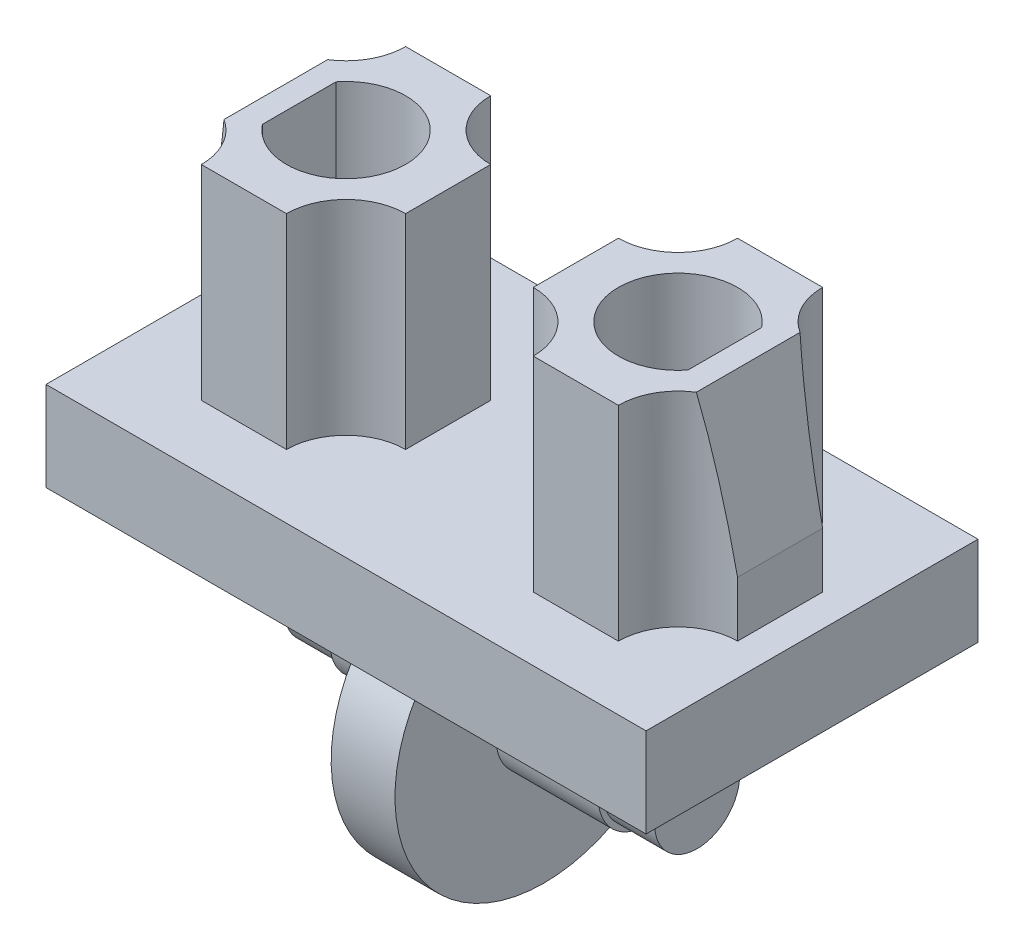
ISO-10303-21;
HEADER;
FILE_DESCRIPTION(('STEP AP214'),'2;1');
FILE_NAME('part.step','',(''),(''),'','','');
FILE_SCHEMA(('AUTOMOTIVE_DESIGN { 1 0 10303 214 1 1 1 1 }'));
ENDSEC;
DATA;
#1=APPLICATION_CONTEXT('core data for automotive mechanical design processes');
#2=APPLICATION_PROTOCOL_DEFINITION('international standard','automotive_design',2000,#1);
#3=PRODUCT_CONTEXT('',#1,'mechanical');
#4=PRODUCT('Part','Part','',(#3));
#5=PRODUCT_RELATED_PRODUCT_CATEGORY('part','',(#4));
#6=PRODUCT_DEFINITION_FORMATION('','',#4);
#7=PRODUCT_DEFINITION_CONTEXT('part definition',#1,'design');
#8=PRODUCT_DEFINITION('design','',#6,#7);
#9=PRODUCT_DEFINITION_SHAPE('','',#8);
#10=(LENGTH_UNIT() NAMED_UNIT(*) SI_UNIT(.MILLI.,.METRE.));
#11=(NAMED_UNIT(*) PLANE_ANGLE_UNIT() SI_UNIT($,.RADIAN.));
#12=(NAMED_UNIT(*) SI_UNIT($,.STERADIAN.) SOLID_ANGLE_UNIT());
#13=UNCERTAINTY_MEASURE_WITH_UNIT(LENGTH_MEASURE(1.E-05),#10,'distance_accuracy_value','');
#14=(GEOMETRIC_REPRESENTATION_CONTEXT(3) GLOBAL_UNCERTAINTY_ASSIGNED_CONTEXT((#13)) GLOBAL_UNIT_ASSIGNED_CONTEXT((#10,
#11,#12)) REPRESENTATION_CONTEXT('',''));
#15=CARTESIAN_POINT('',(0.,0.,0.));
#16=DIRECTION('',(0.,0.,1.));
#17=DIRECTION('',(1.,0.,0.));
#18=AXIS2_PLACEMENT_3D('',#15,#16,#17);
#19=CARTESIAN_POINT('',(-6.3,3.4,-0.999999999999999));
#20=DIRECTION('',(0.977802414077409,-0.209529088730873,0.));
#21=DIRECTION('',(0.,0.,-1.));
#22=AXIS2_PLACEMENT_3D('',#19,#20,#21);
#23=PLANE('',#22);
#24=DIRECTION('',(0.,0.,-1.));
#25=VECTOR('',#24,1.);
#26=CARTESIAN_POINT('',(-6.3,3.4,-0.999999999999999));
#27=LINE('',#26,#25);
#28=CARTESIAN_POINT('',(-6.3,3.4,1.));
#29=VERTEX_POINT('',#28);
#30=CARTESIAN_POINT('',(-6.3,3.4,-0.999999999999999));
#31=VERTEX_POINT('',#30);
#32=EDGE_CURVE('E524',#29,#31,#27,.T.);
#33=ORIENTED_EDGE('',*,*,#32,.F.);
#34=CARTESIAN_POINT('',(-6.3,3.40000000000001,2.4));
#35=DIRECTION('',(0.977802414077409,-0.209529088730873,0.));
#36=DIRECTION('',(-0.209529088730874,-0.97780241407741,0.));
#37=AXIS2_PLACEMENT_3D('',#34,#35,#36);
#38=ELLIPSE('',#37,6.68164982952897,1.4);
#39=CARTESIAN_POINT('',(-5.55,6.9,1.21784095824631));
#40=VERTEX_POINT('',#39);
#41=EDGE_CURVE('E532',#40,#29,#38,.F.);
#42=ORIENTED_EDGE('',*,*,#41,.F.);
#43=DIRECTION('',(0.,0.,1.));
#44=VECTOR('',#43,1.);
#45=CARTESIAN_POINT('',(-5.55,6.9,-2.4));
#46=LINE('',#45,#44);
#47=CARTESIAN_POINT('',(-5.55,6.9,-1.21784095824631));
#48=VERTEX_POINT('',#47);
#49=EDGE_CURVE('E528',#48,#40,#46,.T.);
#50=ORIENTED_EDGE('',*,*,#49,.F.);
#51=CARTESIAN_POINT('',(-6.3,3.4,-2.4));
#52=DIRECTION('',(0.977802414077409,-0.209529088730873,0.));
#53=DIRECTION('',(-0.209529088730874,-0.97780241407741,0.));
#54=AXIS2_PLACEMENT_3D('',#51,#52,#53);
#55=ELLIPSE('',#54,6.68164982952897,1.4);
#56=EDGE_CURVE('E254',#31,#48,#55,.F.);
#57=ORIENTED_EDGE('',*,*,#56,.F.);
#58=EDGE_LOOP('',(#33,#42,#50,#57));
#59=FACE_BOUND('',#58,.T.);
#60=ADVANCED_FACE('F55',(#59),#23,.F.);
#61=CARTESIAN_POINT('',(6.3,3.4,-0.999999999999999));
#62=DIRECTION('',(-0.977802414077409,-0.209529088730873,0.));
#63=DIRECTION('',(0.,0.,1.));
#64=AXIS2_PLACEMENT_3D('',#61,#62,#63);
#65=PLANE('',#64);
#66=DIRECTION('',(0.,0.,1.));
#67=VECTOR('',#66,1.);
#68=CARTESIAN_POINT('',(6.3,3.4,-0.999999999999999));
#69=LINE('',#68,#67);
#70=CARTESIAN_POINT('',(6.3,3.4,-0.999999999999998));
#71=VERTEX_POINT('',#70);
#72=CARTESIAN_POINT('',(6.3,3.4,1.));
#73=VERTEX_POINT('',#72);
#74=EDGE_CURVE('E510',#71,#73,#69,.T.);
#75=ORIENTED_EDGE('',*,*,#74,.F.);
#76=CARTESIAN_POINT('',(6.3,3.4,-2.4));
#77=DIRECTION('',(-0.977802414077409,-0.209529088730873,0.));
#78=DIRECTION('',(0.209529088730873,-0.97780241407741,0.));
#79=AXIS2_PLACEMENT_3D('',#76,#77,#78);
#80=ELLIPSE('',#79,6.68164982952897,1.4);
#81=CARTESIAN_POINT('',(5.55,6.9,-1.21784095824631));
#82=VERTEX_POINT('',#81);
#83=EDGE_CURVE('E518',#82,#71,#80,.F.);
#84=ORIENTED_EDGE('',*,*,#83,.F.);
#85=DIRECTION('',(0.,0.,-1.));
#86=VECTOR('',#85,1.);
#87=CARTESIAN_POINT('',(5.55,6.9,-2.4));
#88=LINE('',#87,#86);
#89=CARTESIAN_POINT('',(5.55,6.9,1.21784095824631));
#90=VERTEX_POINT('',#89);
#91=EDGE_CURVE('E514',#90,#82,#88,.T.);
#92=ORIENTED_EDGE('',*,*,#91,.F.);
#93=CARTESIAN_POINT('',(6.3,3.40000000000001,2.4));
#94=DIRECTION('',(-0.977802414077409,-0.209529088730873,0.));
#95=DIRECTION('',(0.209529088730873,-0.97780241407741,0.));
#96=AXIS2_PLACEMENT_3D('',#93,#94,#95);
#97=ELLIPSE('',#96,6.68164982952897,1.4);
#98=EDGE_CURVE('E521',#73,#90,#97,.F.);
#99=ORIENTED_EDGE('',*,*,#98,.F.);
#100=EDGE_LOOP('',(#75,#84,#92,#99));
#101=FACE_BOUND('',#100,.T.);
#102=ADVANCED_FACE('F575',(#101),#65,.F.);
#103=CARTESIAN_POINT('',(0.,2.1,0.));
#104=DIRECTION('',(0.,1.,0.));
#105=DIRECTION('',(0.,0.,1.));
#106=AXIS2_PLACEMENT_3D('',#103,#104,#105);
#107=PLANE('',#106);
#108=DIRECTION('',(0.,0.,1.));
#109=VECTOR('',#108,1.);
#110=CARTESIAN_POINT('',(1.5,2.1,-0.999999999999999));
#111=LINE('',#110,#109);
#112=CARTESIAN_POINT('',(1.5,2.1,-0.999999999999999));
#113=VERTEX_POINT('',#112);
#114=CARTESIAN_POINT('',(1.5,2.1,1.));
#115=VERTEX_POINT('',#114);
#116=EDGE_CURVE('E418',#113,#115,#111,.T.);
#117=ORIENTED_EDGE('',*,*,#116,.F.);
#118=CARTESIAN_POINT('',(1.5,2.1,-2.4));
#119=DIRECTION('',(0.,-1.,0.));
#120=DIRECTION('',(0.,0.,-1.));
#121=AXIS2_PLACEMENT_3D('',#118,#119,#120);
#122=CIRCLE('',#121,1.4);
#123=CARTESIAN_POINT('',(2.9,2.1,-2.4));
#124=VERTEX_POINT('',#123);
#125=EDGE_CURVE('E389',#124,#113,#122,.T.);
#126=ORIENTED_EDGE('',*,*,#125,.F.);
#127=DIRECTION('',(-1.,0.,0.));
#128=VECTOR('',#127,1.);
#129=CARTESIAN_POINT('',(2.9,2.1,-2.4));
#130=LINE('',#129,#128);
#131=CARTESIAN_POINT('',(4.9,2.1,-2.4));
#132=VERTEX_POINT('',#131);
#133=EDGE_CURVE('E395',#132,#124,#130,.T.);
#134=ORIENTED_EDGE('',*,*,#133,.F.);
#135=CARTESIAN_POINT('',(6.3,2.1,-2.4));
#136=DIRECTION('',(0.,-1.,0.));
#137=DIRECTION('',(0.,0.,1.));
#138=AXIS2_PLACEMENT_3D('',#135,#136,#137);
#139=CIRCLE('',#138,1.4);
#140=CARTESIAN_POINT('',(6.3,2.1,-0.999999999999998));
#141=VERTEX_POINT('',#140);
#142=EDGE_CURVE('E435',#141,#132,#139,.T.);
#143=ORIENTED_EDGE('',*,*,#142,.F.);
#144=DIRECTION('',(0.,0.,-1.));
#145=VECTOR('',#144,1.);
#146=CARTESIAN_POINT('',(6.3,2.1,-0.999999999999999));
#147=LINE('',#146,#145);
#148=CARTESIAN_POINT('',(6.3,2.1,1.));
#149=VERTEX_POINT('',#148);
#150=EDGE_CURVE('E431',#149,#141,#147,.T.);
#151=ORIENTED_EDGE('',*,*,#150,.F.);
#152=CARTESIAN_POINT('',(6.3,2.1,2.4));
#153=DIRECTION('',(0.,-1.,0.));
#154=DIRECTION('',(0.,0.,-1.));
#155=AXIS2_PLACEMENT_3D('',#152,#153,#154);
#156=CIRCLE('',#155,1.4);
#157=CARTESIAN_POINT('',(4.9,2.1,2.4));
#158=VERTEX_POINT('',#157);
#159=EDGE_CURVE('E427',#158,#149,#156,.T.);
#160=ORIENTED_EDGE('',*,*,#159,.F.);
#161=DIRECTION('',(1.,0.,0.));
#162=VECTOR('',#161,1.);
#163=CARTESIAN_POINT('',(2.9,2.1,2.4));
#164=LINE('',#163,#162);
#165=CARTESIAN_POINT('',(2.9,2.1,2.4));
#166=VERTEX_POINT('',#165);
#167=EDGE_CURVE('E424',#166,#158,#164,.T.);
#168=ORIENTED_EDGE('',*,*,#167,.F.);
#169=CARTESIAN_POINT('',(1.5,2.1,2.4));
#170=DIRECTION('',(0.,-1.,0.));
#171=DIRECTION('',(0.,0.,-1.));
#172=AXIS2_PLACEMENT_3D('',#169,#170,#171);
#173=CIRCLE('',#172,1.4);
#174=EDGE_CURVE('E421',#115,#166,#173,.T.);
#175=ORIENTED_EDGE('',*,*,#174,.F.);
#176=EDGE_LOOP('',(#117,#126,#134,#143,#151,#160,#168,#175));
#177=FACE_BOUND('',#176,.T.);
#178=DIRECTION('',(0.,0.,1.));
#179=VECTOR('',#178,1.);
#180=CARTESIAN_POINT('',(-7.05,2.1,-3.9));
#181=LINE('',#180,#179);
#182=CARTESIAN_POINT('',(-7.05,2.1,-3.9));
#183=VERTEX_POINT('',#182);
#184=CARTESIAN_POINT('',(-7.05,2.1,3.9));
#185=VERTEX_POINT('',#184);
#186=EDGE_CURVE('E469',#183,#185,#181,.T.);
#187=ORIENTED_EDGE('',*,*,#186,.T.);
#188=DIRECTION('',(1.,0.,0.));
#189=VECTOR('',#188,1.);
#190=CARTESIAN_POINT('',(-7.05,2.1,3.9));
#191=LINE('',#190,#189);
#192=CARTESIAN_POINT('',(7.05,2.1,3.9));
#193=VERTEX_POINT('',#192);
#194=EDGE_CURVE('E473',#185,#193,#191,.T.);
#195=ORIENTED_EDGE('',*,*,#194,.T.);
#196=DIRECTION('',(0.,0.,-1.));
#197=VECTOR('',#196,1.);
#198=CARTESIAN_POINT('',(7.05,2.1,-3.9));
#199=LINE('',#198,#197);
#200=CARTESIAN_POINT('',(7.05,2.1,-3.9));
#201=VERTEX_POINT('',#200);
#202=EDGE_CURVE('E477',#193,#201,#199,.T.);
#203=ORIENTED_EDGE('',*,*,#202,.T.);
#204=DIRECTION('',(-1.,0.,0.));
#205=VECTOR('',#204,1.);
#206=CARTESIAN_POINT('',(-7.05,2.1,-3.9));
#207=LINE('',#206,#205);
#208=EDGE_CURVE('E480',#201,#183,#207,.T.);
#209=ORIENTED_EDGE('',*,*,#208,.T.);
#210=EDGE_LOOP('',(#187,#195,#203,#209));
#211=FACE_BOUND('',#210,.T.);
#212=DIRECTION('',(0.,0.,1.));
#213=VECTOR('',#212,1.);
#214=CARTESIAN_POINT('',(-6.3,2.1,-0.999999999999999));
#215=LINE('',#214,#213);
#216=CARTESIAN_POINT('',(-6.3,2.1,-0.999999999999999));
#217=VERTEX_POINT('',#216);
#218=CARTESIAN_POINT('',(-6.3,2.1,1.));
#219=VERTEX_POINT('',#218);
#220=EDGE_CURVE('E319',#217,#219,#215,.T.);
#221=ORIENTED_EDGE('',*,*,#220,.F.);
#222=CARTESIAN_POINT('',(-6.3,2.1,-2.4));
#223=DIRECTION('',(0.,-1.,0.));
#224=DIRECTION('',(0.,0.,-1.));
#225=AXIS2_PLACEMENT_3D('',#222,#223,#224);
#226=CIRCLE('',#225,1.4);
#227=CARTESIAN_POINT('',(-4.9,2.1,-2.4));
#228=VERTEX_POINT('',#227);
#229=EDGE_CURVE('E323',#228,#217,#226,.T.);
#230=ORIENTED_EDGE('',*,*,#229,.F.);
#231=DIRECTION('',(-1.,0.,0.));
#232=VECTOR('',#231,1.);
#233=CARTESIAN_POINT('',(-2.9,2.1,-2.4));
#234=LINE('',#233,#232);
#235=CARTESIAN_POINT('',(-2.9,2.1,-2.4));
#236=VERTEX_POINT('',#235);
#237=EDGE_CURVE('E299',#236,#228,#234,.T.);
#238=ORIENTED_EDGE('',*,*,#237,.F.);
#239=CARTESIAN_POINT('',(-1.5,2.1,-2.4));
#240=DIRECTION('',(0.,-1.,0.));
#241=DIRECTION('',(0.,0.,1.));
#242=AXIS2_PLACEMENT_3D('',#239,#240,#241);
#243=CIRCLE('',#242,1.4);
#244=CARTESIAN_POINT('',(-1.5,2.1,-0.999999999999998));
#245=VERTEX_POINT('',#244);
#246=EDGE_CURVE('E302',#245,#236,#243,.T.);
#247=ORIENTED_EDGE('',*,*,#246,.F.);
#248=DIRECTION('',(0.,0.,-1.));
#249=VECTOR('',#248,1.);
#250=CARTESIAN_POINT('',(-1.5,2.1,-0.999999999999999));
#251=LINE('',#250,#249);
#252=CARTESIAN_POINT('',(-1.5,2.1,1.));
#253=VERTEX_POINT('',#252);
#254=EDGE_CURVE('E307',#253,#245,#251,.T.);
#255=ORIENTED_EDGE('',*,*,#254,.F.);
#256=CARTESIAN_POINT('',(-1.5,2.1,2.4));
#257=DIRECTION('',(0.,-1.,0.));
#258=DIRECTION('',(0.,0.,1.));
#259=AXIS2_PLACEMENT_3D('',#256,#257,#258);
#260=CIRCLE('',#259,1.4);
#261=CARTESIAN_POINT('',(-2.9,2.1,2.4));
#262=VERTEX_POINT('',#261);
#263=EDGE_CURVE('E310',#262,#253,#260,.T.);
#264=ORIENTED_EDGE('',*,*,#263,.F.);
#265=DIRECTION('',(1.,0.,0.));
#266=VECTOR('',#265,1.);
#267=CARTESIAN_POINT('',(-2.9,2.1,2.4));
#268=LINE('',#267,#266);
#269=CARTESIAN_POINT('',(-4.9,2.1,2.4));
#270=VERTEX_POINT('',#269);
#271=EDGE_CURVE('E313',#270,#262,#268,.T.);
#272=ORIENTED_EDGE('',*,*,#271,.F.);
#273=CARTESIAN_POINT('',(-6.3,2.1,2.4));
#274=DIRECTION('',(0.,-1.,0.));
#275=DIRECTION('',(0.,0.,1.));
#276=AXIS2_PLACEMENT_3D('',#273,#274,#275);
#277=CIRCLE('',#276,1.4);
#278=EDGE_CURVE('E316',#219,#270,#277,.T.);
#279=ORIENTED_EDGE('',*,*,#278,.F.);
#280=EDGE_LOOP('',(#221,#230,#238,#247,#255,#264,#272,#279));
#281=FACE_BOUND('',#280,.T.);
#282=ADVANCED_FACE('F582',(#177,#211,#281),#107,.T.);
#283=CARTESIAN_POINT('',(-7.05,2.1,-3.9));
#284=DIRECTION('',(1.,0.,0.));
#285=DIRECTION('',(0.,0.,-1.));
#286=AXIS2_PLACEMENT_3D('',#283,#284,#285);
#287=PLANE('',#286);
#288=DIRECTION('',(0.,0.,1.));
#289=VECTOR('',#288,1.);
#290=CARTESIAN_POINT('',(-7.05,0.,-3.9));
#291=LINE('',#290,#289);
#292=CARTESIAN_POINT('',(-7.05,0.,-3.9));
#293=VERTEX_POINT('',#292);
#294=CARTESIAN_POINT('',(-7.05,0.,3.9));
#295=VERTEX_POINT('',#294);
#296=EDGE_CURVE('E468',#293,#295,#291,.T.);
#297=ORIENTED_EDGE('',*,*,#296,.T.);
#298=DIRECTION('',(0.,-1.,0.));
#299=VECTOR('',#298,1.);
#300=CARTESIAN_POINT('',(-7.05,2.1,3.9));
#301=LINE('',#300,#299);
#302=EDGE_CURVE('E506',#185,#295,#301,.T.);
#303=ORIENTED_EDGE('',*,*,#302,.F.);
#304=ORIENTED_EDGE('',*,*,#186,.F.);
#305=DIRECTION('',(0.,-1.,0.));
#306=VECTOR('',#305,1.);
#307=CARTESIAN_POINT('',(-7.05,2.1,-3.9));
#308=LINE('',#307,#306);
#309=EDGE_CURVE('E483',#183,#293,#308,.T.);
#310=ORIENTED_EDGE('',*,*,#309,.T.);
#311=EDGE_LOOP('',(#297,#303,#304,#310));
#312=FACE_BOUND('',#311,.T.);
#313=ADVANCED_FACE('F706',(#312),#287,.F.);
#314=CARTESIAN_POINT('',(-7.05,2.1,3.9));
#315=DIRECTION('',(0.,0.,-1.));
#316=DIRECTION('',(-1.,0.,0.));
#317=AXIS2_PLACEMENT_3D('',#314,#315,#316);
#318=PLANE('',#317);
#319=DIRECTION('',(1.,0.,0.));
#320=VECTOR('',#319,1.);
#321=CARTESIAN_POINT('',(-7.05,0.,3.9));
#322=LINE('',#321,#320);
#323=CARTESIAN_POINT('',(7.05,0.,3.9));
#324=VERTEX_POINT('',#323);
#325=EDGE_CURVE('E487',#295,#324,#322,.T.);
#326=ORIENTED_EDGE('',*,*,#325,.T.);
#327=DIRECTION('',(0.,-1.,0.));
#328=VECTOR('',#327,1.);
#329=CARTESIAN_POINT('',(7.05,2.1,3.9));
#330=LINE('',#329,#328);
#331=EDGE_CURVE('E502',#193,#324,#330,.T.);
#332=ORIENTED_EDGE('',*,*,#331,.F.);
#333=ORIENTED_EDGE('',*,*,#194,.F.);
#334=ORIENTED_EDGE('',*,*,#302,.T.);
#335=EDGE_LOOP('',(#326,#332,#333,#334));
#336=FACE_BOUND('',#335,.T.);
#337=ADVANCED_FACE('F702',(#336),#318,.F.);
#338=CARTESIAN_POINT('',(7.05,2.1,-3.9));
#339=DIRECTION('',(-1.,0.,0.));
#340=DIRECTION('',(0.,0.,1.));
#341=AXIS2_PLACEMENT_3D('',#338,#339,#340);
#342=PLANE('',#341);
#343=DIRECTION('',(0.,0.,-1.));
#344=VECTOR('',#343,1.);
#345=CARTESIAN_POINT('',(7.05,0.,-3.9));
#346=LINE('',#345,#344);
#347=CARTESIAN_POINT('',(7.05,0.,-3.9));
#348=VERTEX_POINT('',#347);
#349=EDGE_CURVE('E490',#324,#348,#346,.T.);
#350=ORIENTED_EDGE('',*,*,#349,.T.);
#351=DIRECTION('',(0.,-1.,0.));
#352=VECTOR('',#351,1.);
#353=CARTESIAN_POINT('',(7.05,2.1,-3.9));
#354=LINE('',#353,#352);
#355=EDGE_CURVE('E498',#201,#348,#354,.T.);
#356=ORIENTED_EDGE('',*,*,#355,.F.);
#357=ORIENTED_EDGE('',*,*,#202,.F.);
#358=ORIENTED_EDGE('',*,*,#331,.T.);
#359=EDGE_LOOP('',(#350,#356,#357,#358));
#360=FACE_BOUND('',#359,.T.);
#361=ADVANCED_FACE('F698',(#360),#342,.F.);
#362=CARTESIAN_POINT('',(-7.05,2.1,-3.9));
#363=DIRECTION('',(0.,0.,1.));
#364=DIRECTION('',(1.,0.,0.));
#365=AXIS2_PLACEMENT_3D('',#362,#363,#364);
#366=PLANE('',#365);
#367=DIRECTION('',(-1.,0.,0.));
#368=VECTOR('',#367,1.);
#369=CARTESIAN_POINT('',(-7.05,0.,-3.9));
#370=LINE('',#369,#368);
#371=EDGE_CURVE('E474',#348,#293,#370,.T.);
#372=ORIENTED_EDGE('',*,*,#371,.T.);
#373=ORIENTED_EDGE('',*,*,#309,.F.);
#374=ORIENTED_EDGE('',*,*,#208,.F.);
#375=ORIENTED_EDGE('',*,*,#355,.T.);
#376=EDGE_LOOP('',(#372,#373,#374,#375));
#377=FACE_BOUND('',#376,.T.);
#378=ADVANCED_FACE('F695',(#377),#366,.F.);
#379=CARTESIAN_POINT('',(0.,0.,0.));
#380=DIRECTION('',(0.,1.,0.));
#381=DIRECTION('',(0.,0.,1.));
#382=AXIS2_PLACEMENT_3D('',#379,#380,#381);
#383=PLANE('',#382);
#384=DIRECTION('',(-1.,0.,0.));
#385=VECTOR('',#384,1.);
#386=CARTESIAN_POINT('',(0.75,0.,2.343074902772));
#387=LINE('',#386,#385);
#388=CARTESIAN_POINT('',(0.75,0.,2.343074902772));
#389=VERTEX_POINT('',#388);
#390=CARTESIAN_POINT('',(-0.75,0.,2.343074902772));
#391=VERTEX_POINT('',#390);
#392=EDGE_CURVE('E78',#389,#391,#387,.T.);
#393=ORIENTED_EDGE('',*,*,#392,.F.);
#394=DIRECTION('',(0.,0.,-1.));
#395=VECTOR('',#394,1.);
#396=CARTESIAN_POINT('',(0.75,0.,0.));
#397=LINE('',#396,#395);
#398=CARTESIAN_POINT('',(0.75,0.,-2.343074902772));
#399=VERTEX_POINT('',#398);
#400=EDGE_CURVE('E73',#389,#399,#397,.T.);
#401=ORIENTED_EDGE('',*,*,#400,.T.);
#402=DIRECTION('',(-1.,0.,0.));
#403=VECTOR('',#402,1.);
#404=CARTESIAN_POINT('',(0.75,0.,-2.343074902772));
#405=LINE('',#404,#403);
#406=CARTESIAN_POINT('',(-0.75,0.,-2.343074902772));
#407=VERTEX_POINT('',#406);
#408=EDGE_CURVE('E238',#407,#399,#405,.F.);
#409=ORIENTED_EDGE('',*,*,#408,.F.);
#410=DIRECTION('',(0.,0.,-1.));
#411=VECTOR('',#410,1.);
#412=CARTESIAN_POINT('',(-0.75,0.,0.));
#413=LINE('',#412,#411);
#414=EDGE_CURVE('E242',#391,#407,#413,.T.);
#415=ORIENTED_EDGE('',*,*,#414,.F.);
#416=EDGE_LOOP('',(#393,#401,#409,#415));
#417=FACE_BOUND('',#416,.T.);
#418=ORIENTED_EDGE('',*,*,#296,.F.);
#419=ORIENTED_EDGE('',*,*,#371,.F.);
#420=ORIENTED_EDGE('',*,*,#349,.F.);
#421=ORIENTED_EDGE('',*,*,#325,.F.);
#422=EDGE_LOOP('',(#418,#419,#420,#421));
#423=FACE_BOUND('',#422,.T.);
#424=ADVANCED_FACE('F240',(#417,#423),#383,.F.);
#425=CARTESIAN_POINT('',(1.5,6.9,-2.4));
#426=DIRECTION('',(0.,-1.,0.));
#427=DIRECTION('',(0.,0.,-1.));
#428=AXIS2_PLACEMENT_3D('',#425,#426,#427);
#429=PLANE('',#428);
#430=CARTESIAN_POINT('',(6.3,6.9,2.4));
#431=DIRECTION('',(0.,-1.,0.));
#432=DIRECTION('',(0.,0.,-1.));
#433=AXIS2_PLACEMENT_3D('',#430,#431,#432);
#434=CIRCLE('',#433,1.4);
#435=CARTESIAN_POINT('',(4.9,6.9,2.4));
#436=VERTEX_POINT('',#435);
#437=EDGE_CURVE('E404',#436,#90,#434,.T.);
#438=ORIENTED_EDGE('',*,*,#437,.T.);
#439=ORIENTED_EDGE('',*,*,#91,.T.);
#440=CARTESIAN_POINT('',(6.3,6.9,-2.4));
#441=DIRECTION('',(0.,-1.,0.));
#442=DIRECTION('',(0.,0.,1.));
#443=AXIS2_PLACEMENT_3D('',#440,#441,#442);
#444=CIRCLE('',#443,1.4);
#445=CARTESIAN_POINT('',(4.9,6.9,-2.4));
#446=VERTEX_POINT('',#445);
#447=EDGE_CURVE('E408',#82,#446,#444,.T.);
#448=ORIENTED_EDGE('',*,*,#447,.T.);
#449=DIRECTION('',(-1.,0.,0.));
#450=VECTOR('',#449,1.);
#451=CARTESIAN_POINT('',(2.9,6.9,-2.4));
#452=LINE('',#451,#450);
#453=CARTESIAN_POINT('',(2.9,6.9,-2.4));
#454=VERTEX_POINT('',#453);
#455=EDGE_CURVE('E411',#446,#454,#452,.T.);
#456=ORIENTED_EDGE('',*,*,#455,.T.);
#457=CARTESIAN_POINT('',(1.5,6.9,-2.4));
#458=DIRECTION('',(0.,-1.,0.));
#459=DIRECTION('',(0.,0.,-1.));
#460=AXIS2_PLACEMENT_3D('',#457,#458,#459);
#461=CIRCLE('',#460,1.4);
#462=CARTESIAN_POINT('',(1.5,6.9,-0.999999999999999));
#463=VERTEX_POINT('',#462);
#464=EDGE_CURVE('E390',#454,#463,#461,.T.);
#465=ORIENTED_EDGE('',*,*,#464,.T.);
#466=DIRECTION('',(0.,0.,1.));
#467=VECTOR('',#466,1.);
#468=CARTESIAN_POINT('',(1.5,6.9,-0.999999999999999));
#469=LINE('',#468,#467);
#470=CARTESIAN_POINT('',(1.5,6.9,1.));
#471=VERTEX_POINT('',#470);
#472=EDGE_CURVE('E394',#463,#471,#469,.T.);
#473=ORIENTED_EDGE('',*,*,#472,.T.);
#474=CARTESIAN_POINT('',(1.5,6.9,2.4));
#475=DIRECTION('',(0.,-1.,0.));
#476=DIRECTION('',(0.,0.,-1.));
#477=AXIS2_PLACEMENT_3D('',#474,#475,#476);
#478=CIRCLE('',#477,1.4);
#479=CARTESIAN_POINT('',(2.9,6.9,2.4));
#480=VERTEX_POINT('',#479);
#481=EDGE_CURVE('E398',#471,#480,#478,.T.);
#482=ORIENTED_EDGE('',*,*,#481,.T.);
#483=DIRECTION('',(1.,0.,0.));
#484=VECTOR('',#483,1.);
#485=CARTESIAN_POINT('',(2.9,6.9,2.4));
#486=LINE('',#485,#484);
#487=EDGE_CURVE('E401',#480,#436,#486,.T.);
#488=ORIENTED_EDGE('',*,*,#487,.T.);
#489=EDGE_LOOP('',(#438,#439,#448,#456,#465,#473,#482,#488));
#490=FACE_BOUND('',#489,.T.);
#491=CARTESIAN_POINT('',(3.9,6.9,0.));
#492=DIRECTION('',(0.,1.,0.));
#493=DIRECTION('',(0.,0.,1.));
#494=AXIS2_PLACEMENT_3D('',#491,#492,#493);
#495=CIRCLE('',#494,1.4);
#496=CARTESIAN_POINT('',(5.,6.9,-0.866025403784441));
#497=VERTEX_POINT('',#496);
#498=CARTESIAN_POINT('',(5.,6.9,0.866025403784441));
#499=VERTEX_POINT('',#498);
#500=EDGE_CURVE('E369',#497,#499,#495,.T.);
#501=ORIENTED_EDGE('',*,*,#500,.F.);
#502=DIRECTION('',(0.,0.,-1.));
#503=VECTOR('',#502,1.);
#504=CARTESIAN_POINT('',(5.,6.9,-0.866025403784441));
#505=LINE('',#504,#503);
#506=EDGE_CURVE('E373',#499,#497,#505,.T.);
#507=ORIENTED_EDGE('',*,*,#506,.F.);
#508=EDGE_LOOP('',(#501,#507));
#509=FACE_BOUND('',#508,.T.);
#510=ADVANCED_FACE('F656',(#490,#509),#429,.F.);
#511=CARTESIAN_POINT('',(1.5,6.9,-2.4));
#512=DIRECTION('',(0.,-1.,0.));
#513=DIRECTION('',(0.,0.,-1.));
#514=AXIS2_PLACEMENT_3D('',#511,#512,#513);
#515=CYLINDRICAL_SURFACE('',#514,1.4);
#516=ORIENTED_EDGE('',*,*,#125,.T.);
#517=DIRECTION('',(0.,-1.,0.));
#518=VECTOR('',#517,1.);
#519=CARTESIAN_POINT('',(1.5,6.9,-0.999999999999999));
#520=LINE('',#519,#518);
#521=EDGE_CURVE('E465',#463,#113,#520,.T.);
#522=ORIENTED_EDGE('',*,*,#521,.F.);
#523=ORIENTED_EDGE('',*,*,#464,.F.);
#524=DIRECTION('',(0.,-1.,0.));
#525=VECTOR('',#524,1.);
#526=CARTESIAN_POINT('',(2.9,6.9,-2.4));
#527=LINE('',#526,#525);
#528=EDGE_CURVE('E414',#454,#124,#527,.T.);
#529=ORIENTED_EDGE('',*,*,#528,.T.);
#530=EDGE_LOOP('',(#516,#522,#523,#529));
#531=FACE_BOUND('',#530,.T.);
#532=ADVANCED_FACE('F659',(#531),#515,.F.);
#533=CARTESIAN_POINT('',(1.5,6.9,-0.999999999999999));
#534=DIRECTION('',(1.,0.,0.));
#535=DIRECTION('',(0.,0.,-1.));
#536=AXIS2_PLACEMENT_3D('',#533,#534,#535);
#537=PLANE('',#536);
#538=ORIENTED_EDGE('',*,*,#116,.T.);
#539=DIRECTION('',(0.,-1.,0.));
#540=VECTOR('',#539,1.);
#541=CARTESIAN_POINT('',(1.5,6.9,1.));
#542=LINE('',#541,#540);
#543=EDGE_CURVE('E461',#471,#115,#542,.T.);
#544=ORIENTED_EDGE('',*,*,#543,.F.);
#545=ORIENTED_EDGE('',*,*,#472,.F.);
#546=ORIENTED_EDGE('',*,*,#521,.T.);
#547=EDGE_LOOP('',(#538,#544,#545,#546));
#548=FACE_BOUND('',#547,.T.);
#549=ADVANCED_FACE('F682',(#548),#537,.F.);
#550=CARTESIAN_POINT('',(1.5,6.9,2.4));
#551=DIRECTION('',(0.,-1.,0.));
#552=DIRECTION('',(0.,0.,-1.));
#553=AXIS2_PLACEMENT_3D('',#550,#551,#552);
#554=CYLINDRICAL_SURFACE('',#553,1.4);
#555=ORIENTED_EDGE('',*,*,#174,.T.);
#556=DIRECTION('',(0.,-1.,0.));
#557=VECTOR('',#556,1.);
#558=CARTESIAN_POINT('',(2.9,6.9,2.4));
#559=LINE('',#558,#557);
#560=EDGE_CURVE('E457',#480,#166,#559,.T.);
#561=ORIENTED_EDGE('',*,*,#560,.F.);
#562=ORIENTED_EDGE('',*,*,#481,.F.);
#563=ORIENTED_EDGE('',*,*,#543,.T.);
#564=EDGE_LOOP('',(#555,#561,#562,#563));
#565=FACE_BOUND('',#564,.T.);
#566=ADVANCED_FACE('F678',(#565),#554,.F.);
#567=CARTESIAN_POINT('',(2.9,6.9,2.4));
#568=DIRECTION('',(0.,0.,-1.));
#569=DIRECTION('',(-1.,0.,0.));
#570=AXIS2_PLACEMENT_3D('',#567,#568,#569);
#571=PLANE('',#570);
#572=ORIENTED_EDGE('',*,*,#167,.T.);
#573=DIRECTION('',(0.,-1.,0.));
#574=VECTOR('',#573,1.);
#575=CARTESIAN_POINT('',(4.9,6.9,2.4));
#576=LINE('',#575,#574);
#577=EDGE_CURVE('E453',#436,#158,#576,.T.);
#578=ORIENTED_EDGE('',*,*,#577,.F.);
#579=ORIENTED_EDGE('',*,*,#487,.F.);
#580=ORIENTED_EDGE('',*,*,#560,.T.);
#581=EDGE_LOOP('',(#572,#578,#579,#580));
#582=FACE_BOUND('',#581,.T.);
#583=ADVANCED_FACE('F674',(#582),#571,.F.);
#584=CARTESIAN_POINT('',(6.3,6.9,2.4));
#585=DIRECTION('',(0.,-1.,0.));
#586=DIRECTION('',(0.,0.,-1.));
#587=AXIS2_PLACEMENT_3D('',#584,#585,#586);
#588=CYLINDRICAL_SURFACE('',#587,1.4);
#589=DIRECTION('',(0.,-1.,0.));
#590=VECTOR('',#589,1.);
#591=CARTESIAN_POINT('',(6.3,6.9,1.));
#592=LINE('',#591,#590);
#593=EDGE_CURVE('E450',#73,#149,#592,.T.);
#594=ORIENTED_EDGE('',*,*,#593,.F.);
#595=ORIENTED_EDGE('',*,*,#98,.T.);
#596=ORIENTED_EDGE('',*,*,#437,.F.);
#597=ORIENTED_EDGE('',*,*,#577,.T.);
#598=ORIENTED_EDGE('',*,*,#159,.T.);
#599=EDGE_LOOP('',(#594,#595,#596,#597,#598));
#600=FACE_BOUND('',#599,.T.);
#601=ADVANCED_FACE('F670',(#600),#588,.F.);
#602=CARTESIAN_POINT('',(6.3,6.9,-0.999999999999999));
#603=DIRECTION('',(-1.,0.,0.));
#604=DIRECTION('',(0.,0.,1.));
#605=AXIS2_PLACEMENT_3D('',#602,#603,#604);
#606=PLANE('',#605);
#607=DIRECTION('',(0.,-1.,0.));
#608=VECTOR('',#607,1.);
#609=CARTESIAN_POINT('',(6.3,6.9,-0.999999999999998));
#610=LINE('',#609,#608);
#611=EDGE_CURVE('E447',#71,#141,#610,.T.);
#612=ORIENTED_EDGE('',*,*,#611,.F.);
#613=ORIENTED_EDGE('',*,*,#74,.T.);
#614=ORIENTED_EDGE('',*,*,#593,.T.);
#615=ORIENTED_EDGE('',*,*,#150,.T.);
#616=EDGE_LOOP('',(#612,#613,#614,#615));
#617=FACE_BOUND('',#616,.T.);
#618=ADVANCED_FACE('F666',(#617),#606,.F.);
#619=CARTESIAN_POINT('',(6.3,6.9,-2.4));
#620=DIRECTION('',(0.,-1.,0.));
#621=DIRECTION('',(0.,0.,-1.));
#622=AXIS2_PLACEMENT_3D('',#619,#620,#621);
#623=CYLINDRICAL_SURFACE('',#622,1.4);
#624=ORIENTED_EDGE('',*,*,#447,.F.);
#625=ORIENTED_EDGE('',*,*,#83,.T.);
#626=ORIENTED_EDGE('',*,*,#611,.T.);
#627=ORIENTED_EDGE('',*,*,#142,.T.);
#628=DIRECTION('',(0.,-1.,0.));
#629=VECTOR('',#628,1.);
#630=CARTESIAN_POINT('',(4.9,6.9,-2.4));
#631=LINE('',#630,#629);
#632=EDGE_CURVE('E444',#446,#132,#631,.T.);
#633=ORIENTED_EDGE('',*,*,#632,.F.);
#634=EDGE_LOOP('',(#624,#625,#626,#627,#633));
#635=FACE_BOUND('',#634,.T.);
#636=ADVANCED_FACE('F663',(#635),#623,.F.);
#637=CARTESIAN_POINT('',(2.9,6.9,-2.4));
#638=DIRECTION('',(0.,0.,1.));
#639=DIRECTION('',(1.,0.,0.));
#640=AXIS2_PLACEMENT_3D('',#637,#638,#639);
#641=PLANE('',#640);
#642=ORIENTED_EDGE('',*,*,#133,.T.);
#643=ORIENTED_EDGE('',*,*,#528,.F.);
#644=ORIENTED_EDGE('',*,*,#455,.F.);
#645=ORIENTED_EDGE('',*,*,#632,.T.);
#646=EDGE_LOOP('',(#642,#643,#644,#645));
#647=FACE_BOUND('',#646,.T.);
#648=ADVANCED_FACE('F654',(#647),#641,.F.);
#649=CARTESIAN_POINT('',(3.9,6.9,0.));
#650=DIRECTION('',(0.,-1.,0.));
#651=DIRECTION('',(0.,0.,-1.));
#652=AXIS2_PLACEMENT_3D('',#649,#650,#651);
#653=CYLINDRICAL_SURFACE('',#652,1.4);
#654=CARTESIAN_POINT('',(3.9,2.1,0.));
#655=DIRECTION('',(0.,1.,0.));
#656=DIRECTION('',(0.,0.,1.));
#657=AXIS2_PLACEMENT_3D('',#654,#655,#656);
#658=CIRCLE('',#657,1.4);
#659=CARTESIAN_POINT('',(5.,2.1,-0.866025403784441));
#660=VERTEX_POINT('',#659);
#661=CARTESIAN_POINT('',(5.,2.1,0.866025403784441));
#662=VERTEX_POINT('',#661);
#663=EDGE_CURVE('E363',#660,#662,#658,.T.);
#664=ORIENTED_EDGE('',*,*,#663,.F.);
#665=DIRECTION('',(0.,-1.,0.));
#666=VECTOR('',#665,1.);
#667=CARTESIAN_POINT('',(5.,6.9,-0.866025403784441));
#668=LINE('',#667,#666);
#669=EDGE_CURVE('E377',#497,#660,#668,.T.);
#670=ORIENTED_EDGE('',*,*,#669,.F.);
#671=ORIENTED_EDGE('',*,*,#500,.T.);
#672=DIRECTION('',(0.,-1.,0.));
#673=VECTOR('',#672,1.);
#674=CARTESIAN_POINT('',(5.,6.9,0.866025403784441));
#675=LINE('',#674,#673);
#676=EDGE_CURVE('E385',#499,#662,#675,.T.);
#677=ORIENTED_EDGE('',*,*,#676,.T.);
#678=EDGE_LOOP('',(#664,#670,#671,#677));
#679=FACE_BOUND('',#678,.T.);
#680=ADVANCED_FACE('F650',(#679),#653,.F.);
#681=CARTESIAN_POINT('',(5.,6.9,-0.866025403784441));
#682=DIRECTION('',(-1.,0.,0.));
#683=DIRECTION('',(0.,0.,1.));
#684=AXIS2_PLACEMENT_3D('',#681,#682,#683);
#685=PLANE('',#684);
#686=DIRECTION('',(0.,0.,-1.));
#687=VECTOR('',#686,1.);
#688=CARTESIAN_POINT('',(5.,2.1,-0.866025403784441));
#689=LINE('',#688,#687);
#690=EDGE_CURVE('E374',#662,#660,#689,.T.);
#691=ORIENTED_EDGE('',*,*,#690,.F.);
#692=ORIENTED_EDGE('',*,*,#676,.F.);
#693=ORIENTED_EDGE('',*,*,#506,.T.);
#694=ORIENTED_EDGE('',*,*,#669,.T.);
#695=EDGE_LOOP('',(#691,#692,#693,#694));
#696=FACE_BOUND('',#695,.T.);
#697=ADVANCED_FACE('F647',(#696),#685,.T.);
#698=ORIENTED_EDGE('',*,*,#663,.T.);
#699=ORIENTED_EDGE('',*,*,#690,.T.);
#700=EDGE_LOOP('',(#698,#699));
#701=FACE_BOUND('',#700,.T.);
#702=ADVANCED_FACE('F642',(#701),#107,.T.);
#703=CARTESIAN_POINT('',(-6.3,6.9,-2.4));
#704=DIRECTION('',(0.,-1.,0.));
#705=DIRECTION('',(0.,0.,-1.));
#706=AXIS2_PLACEMENT_3D('',#703,#704,#705);
#707=PLANE('',#706);
#708=CARTESIAN_POINT('',(-6.3,6.9,-2.4));
#709=DIRECTION('',(0.,-1.,0.));
#710=DIRECTION('',(0.,0.,-1.));
#711=AXIS2_PLACEMENT_3D('',#708,#709,#710);
#712=CIRCLE('',#711,1.4);
#713=CARTESIAN_POINT('',(-4.9,6.9,-2.4));
#714=VERTEX_POINT('',#713);
#715=EDGE_CURVE('E303',#714,#48,#712,.T.);
#716=ORIENTED_EDGE('',*,*,#715,.T.);
#717=ORIENTED_EDGE('',*,*,#49,.T.);
#718=CARTESIAN_POINT('',(-6.3,6.9,2.4));
#719=DIRECTION('',(0.,-1.,0.));
#720=DIRECTION('',(0.,0.,1.));
#721=AXIS2_PLACEMENT_3D('',#718,#719,#720);
#722=CIRCLE('',#721,1.4);
#723=CARTESIAN_POINT('',(-4.9,6.9,2.4));
#724=VERTEX_POINT('',#723);
#725=EDGE_CURVE('E342',#40,#724,#722,.T.);
#726=ORIENTED_EDGE('',*,*,#725,.T.);
#727=DIRECTION('',(1.,0.,0.));
#728=VECTOR('',#727,1.);
#729=CARTESIAN_POINT('',(-2.9,6.9,2.4));
#730=LINE('',#729,#728);
#731=CARTESIAN_POINT('',(-2.9,6.9,2.4));
#732=VERTEX_POINT('',#731);
#733=EDGE_CURVE('E339',#724,#732,#730,.T.);
#734=ORIENTED_EDGE('',*,*,#733,.T.);
#735=CARTESIAN_POINT('',(-1.5,6.9,2.4));
#736=DIRECTION('',(0.,-1.,0.));
#737=DIRECTION('',(0.,0.,1.));
#738=AXIS2_PLACEMENT_3D('',#735,#736,#737);
#739=CIRCLE('',#738,1.4);
#740=CARTESIAN_POINT('',(-1.5,6.9,1.));
#741=VERTEX_POINT('',#740);
#742=EDGE_CURVE('E336',#732,#741,#739,.T.);
#743=ORIENTED_EDGE('',*,*,#742,.T.);
#744=DIRECTION('',(0.,0.,-1.));
#745=VECTOR('',#744,1.);
#746=CARTESIAN_POINT('',(-1.5,6.9,-0.999999999999999));
#747=LINE('',#746,#745);
#748=CARTESIAN_POINT('',(-1.5,6.9,-0.999999999999998));
#749=VERTEX_POINT('',#748);
#750=EDGE_CURVE('E333',#741,#749,#747,.T.);
#751=ORIENTED_EDGE('',*,*,#750,.T.);
#752=CARTESIAN_POINT('',(-1.5,6.9,-2.4));
#753=DIRECTION('',(0.,-1.,0.));
#754=DIRECTION('',(0.,0.,1.));
#755=AXIS2_PLACEMENT_3D('',#752,#753,#754);
#756=CIRCLE('',#755,1.4);
#757=CARTESIAN_POINT('',(-2.9,6.9,-2.4));
#758=VERTEX_POINT('',#757);
#759=EDGE_CURVE('E330',#749,#758,#756,.T.);
#760=ORIENTED_EDGE('',*,*,#759,.T.);
#761=DIRECTION('',(-1.,0.,0.));
#762=VECTOR('',#761,1.);
#763=CARTESIAN_POINT('',(-2.9,6.9,-2.4));
#764=LINE('',#763,#762);
#765=EDGE_CURVE('E298',#758,#714,#764,.T.);
#766=ORIENTED_EDGE('',*,*,#765,.T.);
#767=EDGE_LOOP('',(#716,#717,#726,#734,#743,#751,#760,#766));
#768=FACE_BOUND('',#767,.T.);
#769=CARTESIAN_POINT('',(-3.9,6.9,0.));
#770=DIRECTION('',(0.,1.,0.));
#771=DIRECTION('',(0.,0.,-1.));
#772=AXIS2_PLACEMENT_3D('',#769,#770,#771);
#773=CIRCLE('',#772,1.4);
#774=CARTESIAN_POINT('',(-5.,6.9,0.866025403784441));
#775=VERTEX_POINT('',#774);
#776=CARTESIAN_POINT('',(-5.,6.9,-0.866025403784441));
#777=VERTEX_POINT('',#776);
#778=EDGE_CURVE('E360',#775,#777,#773,.T.);
#779=ORIENTED_EDGE('',*,*,#778,.F.);
#780=DIRECTION('',(0.,0.,1.));
#781=VECTOR('',#780,1.);
#782=CARTESIAN_POINT('',(-5.,6.9,-0.866025403784441));
#783=LINE('',#782,#781);
#784=EDGE_CURVE('E355',#777,#775,#783,.T.);
#785=ORIENTED_EDGE('',*,*,#784,.F.);
#786=EDGE_LOOP('',(#779,#785));
#787=FACE_BOUND('',#786,.T.);
#788=ADVANCED_FACE('F598',(#768,#787),#707,.F.);
#789=CARTESIAN_POINT('',(-6.3,6.9,-2.4));
#790=DIRECTION('',(0.,-1.,0.));
#791=DIRECTION('',(0.,0.,-1.));
#792=AXIS2_PLACEMENT_3D('',#789,#790,#791);
#793=CYLINDRICAL_SURFACE('',#792,1.4);
#794=DIRECTION('',(0.,-1.,0.));
#795=VECTOR('',#794,1.);
#796=CARTESIAN_POINT('',(-6.3,6.9,-0.999999999999999));
#797=LINE('',#796,#795);
#798=EDGE_CURVE('E263',#31,#217,#797,.T.);
#799=ORIENTED_EDGE('',*,*,#798,.F.);
#800=ORIENTED_EDGE('',*,*,#56,.T.);
#801=ORIENTED_EDGE('',*,*,#715,.F.);
#802=DIRECTION('',(0.,-1.,0.));
#803=VECTOR('',#802,1.);
#804=CARTESIAN_POINT('',(-4.9,6.9,-2.4));
#805=LINE('',#804,#803);
#806=EDGE_CURVE('E294',#714,#228,#805,.T.);
#807=ORIENTED_EDGE('',*,*,#806,.T.);
#808=ORIENTED_EDGE('',*,*,#229,.T.);
#809=EDGE_LOOP('',(#799,#800,#801,#807,#808));
#810=FACE_BOUND('',#809,.T.);
#811=ADVANCED_FACE('F605',(#810),#793,.F.);
#812=CARTESIAN_POINT('',(-6.3,6.9,-0.999999999999999));
#813=DIRECTION('',(1.,0.,0.));
#814=DIRECTION('',(0.,0.,-1.));
#815=AXIS2_PLACEMENT_3D('',#812,#813,#814);
#816=PLANE('',#815);
#817=DIRECTION('',(0.,-1.,0.));
#818=VECTOR('',#817,1.);
#819=CARTESIAN_POINT('',(-6.3,6.9,1.));
#820=LINE('',#819,#818);
#821=EDGE_CURVE('E272',#29,#219,#820,.T.);
#822=ORIENTED_EDGE('',*,*,#821,.F.);
#823=ORIENTED_EDGE('',*,*,#32,.T.);
#824=ORIENTED_EDGE('',*,*,#798,.T.);
#825=ORIENTED_EDGE('',*,*,#220,.T.);
#826=EDGE_LOOP('',(#822,#823,#824,#825));
#827=FACE_BOUND('',#826,.T.);
#828=ADVANCED_FACE('F589',(#827),#816,.F.);
#829=CARTESIAN_POINT('',(-6.3,6.9,2.4));
#830=DIRECTION('',(0.,-1.,0.));
#831=DIRECTION('',(0.,0.,-1.));
#832=AXIS2_PLACEMENT_3D('',#829,#830,#831);
#833=CYLINDRICAL_SURFACE('',#832,1.4);
#834=ORIENTED_EDGE('',*,*,#725,.F.);
#835=ORIENTED_EDGE('',*,*,#41,.T.);
#836=ORIENTED_EDGE('',*,*,#821,.T.);
#837=ORIENTED_EDGE('',*,*,#278,.T.);
#838=DIRECTION('',(0.,-1.,0.));
#839=VECTOR('',#838,1.);
#840=CARTESIAN_POINT('',(-4.9,6.9,2.4));
#841=LINE('',#840,#839);
#842=EDGE_CURVE('E275',#724,#270,#841,.T.);
#843=ORIENTED_EDGE('',*,*,#842,.F.);
#844=EDGE_LOOP('',(#834,#835,#836,#837,#843));
#845=FACE_BOUND('',#844,.T.);
#846=ADVANCED_FACE('F594',(#845),#833,.F.);
#847=CARTESIAN_POINT('',(-2.9,6.9,2.4));
#848=DIRECTION('',(0.,0.,-1.));
#849=DIRECTION('',(-1.,0.,0.));
#850=AXIS2_PLACEMENT_3D('',#847,#848,#849);
#851=PLANE('',#850);
#852=ORIENTED_EDGE('',*,*,#271,.T.);
#853=DIRECTION('',(0.,-1.,0.));
#854=VECTOR('',#853,1.);
#855=CARTESIAN_POINT('',(-2.9,6.9,2.4));
#856=LINE('',#855,#854);
#857=EDGE_CURVE('E279',#732,#262,#856,.T.);
#858=ORIENTED_EDGE('',*,*,#857,.F.);
#859=ORIENTED_EDGE('',*,*,#733,.F.);
#860=ORIENTED_EDGE('',*,*,#842,.T.);
#861=EDGE_LOOP('',(#852,#858,#859,#860));
#862=FACE_BOUND('',#861,.T.);
#863=ADVANCED_FACE('F613',(#862),#851,.F.);
#864=CARTESIAN_POINT('',(-1.5,6.9,2.4));
#865=DIRECTION('',(0.,-1.,0.));
#866=DIRECTION('',(0.,0.,-1.));
#867=AXIS2_PLACEMENT_3D('',#864,#865,#866);
#868=CYLINDRICAL_SURFACE('',#867,1.4);
#869=ORIENTED_EDGE('',*,*,#263,.T.);
#870=DIRECTION('',(0.,-1.,0.));
#871=VECTOR('',#870,1.);
#872=CARTESIAN_POINT('',(-1.5,6.9,1.));
#873=LINE('',#872,#871);
#874=EDGE_CURVE('E283',#741,#253,#873,.T.);
#875=ORIENTED_EDGE('',*,*,#874,.F.);
#876=ORIENTED_EDGE('',*,*,#742,.F.);
#877=ORIENTED_EDGE('',*,*,#857,.T.);
#878=EDGE_LOOP('',(#869,#875,#876,#877));
#879=FACE_BOUND('',#878,.T.);
#880=ADVANCED_FACE('F616',(#879),#868,.F.);
#881=CARTESIAN_POINT('',(-1.5,6.9,-0.999999999999999));
#882=DIRECTION('',(-1.,0.,0.));
#883=DIRECTION('',(0.,0.,1.));
#884=AXIS2_PLACEMENT_3D('',#881,#882,#883);
#885=PLANE('',#884);
#886=ORIENTED_EDGE('',*,*,#254,.T.);
#887=DIRECTION('',(0.,-1.,0.));
#888=VECTOR('',#887,1.);
#889=CARTESIAN_POINT('',(-1.5,6.9,-0.999999999999998));
#890=LINE('',#889,#888);
#891=EDGE_CURVE('E287',#749,#245,#890,.T.);
#892=ORIENTED_EDGE('',*,*,#891,.F.);
#893=ORIENTED_EDGE('',*,*,#750,.F.);
#894=ORIENTED_EDGE('',*,*,#874,.T.);
#895=EDGE_LOOP('',(#886,#892,#893,#894));
#896=FACE_BOUND('',#895,.T.);
#897=ADVANCED_FACE('F623',(#896),#885,.F.);
#898=CARTESIAN_POINT('',(-1.5,6.9,-2.4));
#899=DIRECTION('',(0.,-1.,0.));
#900=DIRECTION('',(0.,0.,-1.));
#901=AXIS2_PLACEMENT_3D('',#898,#899,#900);
#902=CYLINDRICAL_SURFACE('',#901,1.4);
#903=ORIENTED_EDGE('',*,*,#246,.T.);
#904=DIRECTION('',(0.,-1.,0.));
#905=VECTOR('',#904,1.);
#906=CARTESIAN_POINT('',(-2.9,6.9,-2.4));
#907=LINE('',#906,#905);
#908=EDGE_CURVE('E291',#758,#236,#907,.T.);
#909=ORIENTED_EDGE('',*,*,#908,.F.);
#910=ORIENTED_EDGE('',*,*,#759,.F.);
#911=ORIENTED_EDGE('',*,*,#891,.T.);
#912=EDGE_LOOP('',(#903,#909,#910,#911));
#913=FACE_BOUND('',#912,.T.);
#914=ADVANCED_FACE('F626',(#913),#902,.F.);
#915=CARTESIAN_POINT('',(-2.9,6.9,-2.4));
#916=DIRECTION('',(0.,0.,1.));
#917=DIRECTION('',(1.,0.,0.));
#918=AXIS2_PLACEMENT_3D('',#915,#916,#917);
#919=PLANE('',#918);
#920=ORIENTED_EDGE('',*,*,#237,.T.);
#921=ORIENTED_EDGE('',*,*,#806,.F.);
#922=ORIENTED_EDGE('',*,*,#765,.F.);
#923=ORIENTED_EDGE('',*,*,#908,.T.);
#924=EDGE_LOOP('',(#920,#921,#922,#923));
#925=FACE_BOUND('',#924,.T.);
#926=ADVANCED_FACE('F628',(#925),#919,.F.);
#927=CARTESIAN_POINT('',(-3.9,6.9,0.));
#928=DIRECTION('',(0.,-1.,0.));
#929=DIRECTION('',(0.,0.,-1.));
#930=AXIS2_PLACEMENT_3D('',#927,#928,#929);
#931=CYLINDRICAL_SURFACE('',#930,1.4);
#932=CARTESIAN_POINT('',(-3.9,2.1,0.));
#933=DIRECTION('',(0.,1.,0.));
#934=DIRECTION('',(0.,0.,-1.));
#935=AXIS2_PLACEMENT_3D('',#932,#933,#934);
#936=CIRCLE('',#935,1.4);
#937=CARTESIAN_POINT('',(-5.,2.1,0.866025403784441));
#938=VERTEX_POINT('',#937);
#939=CARTESIAN_POINT('',(-5.,2.1,-0.866025403784441));
#940=VERTEX_POINT('',#939);
#941=EDGE_CURVE('E359',#938,#940,#936,.T.);
#942=ORIENTED_EDGE('',*,*,#941,.F.);
#943=DIRECTION('',(0.,-1.,0.));
#944=VECTOR('',#943,1.);
#945=CARTESIAN_POINT('',(-5.,6.9,0.866025403784441));
#946=LINE('',#945,#944);
#947=EDGE_CURVE('E351',#775,#938,#946,.T.);
#948=ORIENTED_EDGE('',*,*,#947,.F.);
#949=ORIENTED_EDGE('',*,*,#778,.T.);
#950=DIRECTION('',(0.,-1.,0.));
#951=VECTOR('',#950,1.);
#952=CARTESIAN_POINT('',(-5.,6.9,-0.866025403784441));
#953=LINE('',#952,#951);
#954=EDGE_CURVE('E327',#777,#940,#953,.T.);
#955=ORIENTED_EDGE('',*,*,#954,.T.);
#956=EDGE_LOOP('',(#942,#948,#949,#955));
#957=FACE_BOUND('',#956,.T.);
#958=ADVANCED_FACE('F630',(#957),#931,.F.);
#959=CARTESIAN_POINT('',(-5.,6.9,-0.866025403784441));
#960=DIRECTION('',(1.,0.,0.));
#961=DIRECTION('',(0.,0.,-1.));
#962=AXIS2_PLACEMENT_3D('',#959,#960,#961);
#963=PLANE('',#962);
#964=DIRECTION('',(0.,0.,1.));
#965=VECTOR('',#964,1.);
#966=CARTESIAN_POINT('',(-5.,2.1,-0.866025403784441));
#967=LINE('',#966,#965);
#968=EDGE_CURVE('E356',#940,#938,#967,.T.);
#969=ORIENTED_EDGE('',*,*,#968,.F.);
#970=ORIENTED_EDGE('',*,*,#954,.F.);
#971=ORIENTED_EDGE('',*,*,#784,.T.);
#972=ORIENTED_EDGE('',*,*,#947,.T.);
#973=EDGE_LOOP('',(#969,#970,#971,#972));
#974=FACE_BOUND('',#973,.T.);
#975=ADVANCED_FACE('F636',(#974),#963,.T.);
#976=ORIENTED_EDGE('',*,*,#941,.T.);
#977=ORIENTED_EDGE('',*,*,#968,.T.);
#978=EDGE_LOOP('',(#976,#977));
#979=FACE_BOUND('',#978,.T.);
#980=ADVANCED_FACE('F571',(#979),#107,.T.);
#981=CARTESIAN_POINT('',(0.75,-2.6,0.));
#982=DIRECTION('',(-1.,0.,0.));
#983=DIRECTION('',(0.,0.,1.));
#984=AXIS2_PLACEMENT_3D('',#981,#982,#983);
#985=CYLINDRICAL_SURFACE('',#984,3.5);
#986=CARTESIAN_POINT('',(-0.75,-2.6,0.));
#987=DIRECTION('',(1.,0.,0.));
#988=DIRECTION('',(0.,0.,-1.));
#989=AXIS2_PLACEMENT_3D('',#986,#987,#988);
#990=CIRCLE('',#989,3.5);
#991=EDGE_CURVE('E252',#391,#407,#990,.T.);
#992=ORIENTED_EDGE('',*,*,#991,.T.);
#993=ORIENTED_EDGE('',*,*,#408,.T.);
#994=CARTESIAN_POINT('',(0.75,-2.6,0.));
#995=DIRECTION('',(1.,0.,0.));
#996=DIRECTION('',(0.,0.,-1.));
#997=AXIS2_PLACEMENT_3D('',#994,#995,#996);
#998=CIRCLE('',#997,3.5);
#999=EDGE_CURVE('E258',#389,#399,#998,.T.);
#1000=ORIENTED_EDGE('',*,*,#999,.F.);
#1001=ORIENTED_EDGE('',*,*,#392,.T.);
#1002=EDGE_LOOP('',(#992,#993,#1000,#1001));
#1003=FACE_BOUND('',#1002,.T.);
#1004=ADVANCED_FACE('F256',(#1003),#985,.T.);
#1005=CARTESIAN_POINT('',(0.75,-2.6,0.));
#1006=DIRECTION('',(1.,0.,0.));
#1007=DIRECTION('',(0.,0.,-1.));
#1008=AXIS2_PLACEMENT_3D('',#1005,#1006,#1007);
#1009=PLANE('',#1008);
#1010=CARTESIAN_POINT('',(0.75,-2.6,0.));
#1011=DIRECTION('',(1.,0.,0.));
#1012=DIRECTION('',(0.,0.,-1.));
#1013=AXIS2_PLACEMENT_3D('',#1010,#1011,#1012);
#1014=CIRCLE('',#1013,1.125);
#1015=CARTESIAN_POINT('',(0.75,-2.6,-1.125));
#1016=VERTEX_POINT('',#1015);
#1017=EDGE_CURVE('E266',#1016,#1016,#1014,.T.);
#1018=ORIENTED_EDGE('',*,*,#1017,.F.);
#1019=EDGE_LOOP('',(#1018));
#1020=FACE_BOUND('',#1019,.T.);
#1021=ORIENTED_EDGE('',*,*,#400,.F.);
#1022=ORIENTED_EDGE('',*,*,#999,.T.);
#1023=EDGE_LOOP('',(#1021,#1022));
#1024=FACE_BOUND('',#1023,.T.);
#1025=ADVANCED_FACE('F560',(#1020,#1024),#1009,.T.);
#1026=CARTESIAN_POINT('',(-0.75,-2.6,0.));
#1027=DIRECTION('',(1.,0.,0.));
#1028=DIRECTION('',(0.,0.,-1.));
#1029=AXIS2_PLACEMENT_3D('',#1026,#1027,#1028);
#1030=PLANE('',#1029);
#1031=CARTESIAN_POINT('',(-0.75,-2.6,0.));
#1032=DIRECTION('',(1.,0.,0.));
#1033=DIRECTION('',(0.,0.,-1.));
#1034=AXIS2_PLACEMENT_3D('',#1031,#1032,#1033);
#1035=CIRCLE('',#1034,1.125);
#1036=CARTESIAN_POINT('',(-0.75,-2.6,-1.125));
#1037=VERTEX_POINT('',#1036);
#1038=EDGE_CURVE('E59',#1037,#1037,#1035,.F.);
#1039=ORIENTED_EDGE('',*,*,#1038,.F.);
#1040=EDGE_LOOP('',(#1039));
#1041=FACE_BOUND('',#1040,.T.);
#1042=ORIENTED_EDGE('',*,*,#991,.F.);
#1043=ORIENTED_EDGE('',*,*,#414,.T.);
#1044=EDGE_LOOP('',(#1042,#1043));
#1045=FACE_BOUND('',#1044,.T.);
#1046=ADVANCED_FACE('F251',(#1041,#1045),#1030,.F.);
#1047=CARTESIAN_POINT('',(3.15,-2.6,0.));
#1048=DIRECTION('',(-1.,0.,0.));
#1049=DIRECTION('',(0.,0.,1.));
#1050=AXIS2_PLACEMENT_3D('',#1047,#1048,#1049);
#1051=CYLINDRICAL_SURFACE('',#1050,1.125);
#1052=CARTESIAN_POINT('',(3.15,-2.6,0.));
#1053=DIRECTION('',(1.,0.,0.));
#1054=DIRECTION('',(0.,0.,-1.));
#1055=AXIS2_PLACEMENT_3D('',#1052,#1053,#1054);
#1056=CIRCLE('',#1055,1.125);
#1057=CARTESIAN_POINT('',(3.15,-2.6,-1.125));
#1058=VERTEX_POINT('',#1057);
#1059=EDGE_CURVE('E259',#1058,#1058,#1056,.T.);
#1060=ORIENTED_EDGE('',*,*,#1059,.F.);
#1061=EDGE_LOOP('',(#1060));
#1062=FACE_BOUND('',#1061,.T.);
#1063=ORIENTED_EDGE('',*,*,#1017,.T.);
#1064=EDGE_LOOP('',(#1063));
#1065=FACE_BOUND('',#1064,.T.);
#1066=ADVANCED_FACE('F558',(#1062,#1065),#1051,.T.);
#1067=CARTESIAN_POINT('',(3.15,-2.6,0.));
#1068=DIRECTION('',(1.,0.,0.));
#1069=DIRECTION('',(0.,0.,-1.));
#1070=AXIS2_PLACEMENT_3D('',#1067,#1068,#1069);
#1071=PLANE('',#1070);
#1072=CARTESIAN_POINT('',(3.15,-2.6,0.));
#1073=DIRECTION('',(1.,0.,0.));
#1074=DIRECTION('',(0.,0.,-1.));
#1075=AXIS2_PLACEMENT_3D('',#1072,#1073,#1074);
#1076=CIRCLE('',#1075,1.);
#1077=CARTESIAN_POINT('',(3.15,-2.6,-1.));
#1078=VERTEX_POINT('',#1077);
#1079=EDGE_CURVE('E13',#1078,#1078,#1076,.T.);
#1080=ORIENTED_EDGE('',*,*,#1079,.F.);
#1081=EDGE_LOOP('',(#1080));
#1082=FACE_BOUND('',#1081,.T.);
#1083=ORIENTED_EDGE('',*,*,#1059,.T.);
#1084=EDGE_LOOP('',(#1083));
#1085=FACE_BOUND('',#1084,.T.);
#1086=ADVANCED_FACE('F890',(#1082,#1085),#1071,.T.);
#1087=CARTESIAN_POINT('',(-3.15,-2.6,0.));
#1088=DIRECTION('',(1.,0.,0.));
#1089=DIRECTION('',(0.,0.,-1.));
#1090=AXIS2_PLACEMENT_3D('',#1087,#1088,#1089);
#1091=CYLINDRICAL_SURFACE('',#1090,1.125);
#1092=CARTESIAN_POINT('',(-3.15,-2.6,0.));
#1093=DIRECTION('',(-1.,0.,0.));
#1094=DIRECTION('',(0.,0.,1.));
#1095=AXIS2_PLACEMENT_3D('',#1092,#1093,#1094);
#1096=CIRCLE('',#1095,1.125);
#1097=CARTESIAN_POINT('',(-3.15,-2.6,1.125));
#1098=VERTEX_POINT('',#1097);
#1099=EDGE_CURVE('E551',#1098,#1098,#1096,.T.);
#1100=ORIENTED_EDGE('',*,*,#1099,.F.);
#1101=EDGE_LOOP('',(#1100));
#1102=FACE_BOUND('',#1101,.T.);
#1103=ORIENTED_EDGE('',*,*,#1038,.T.);
#1104=EDGE_LOOP('',(#1103));
#1105=FACE_BOUND('',#1104,.T.);
#1106=ADVANCED_FACE('F898',(#1102,#1105),#1091,.T.);
#1107=CARTESIAN_POINT('',(-3.15,-2.6,0.));
#1108=DIRECTION('',(-1.,0.,0.));
#1109=DIRECTION('',(0.,0.,1.));
#1110=AXIS2_PLACEMENT_3D('',#1107,#1108,#1109);
#1111=PLANE('',#1110);
#1112=CARTESIAN_POINT('',(-3.15,-2.6,0.));
#1113=DIRECTION('',(-1.,0.,0.));
#1114=DIRECTION('',(0.,0.,1.));
#1115=AXIS2_PLACEMENT_3D('',#1112,#1113,#1114);
#1116=CIRCLE('',#1115,1.);
#1117=CARTESIAN_POINT('',(-3.15,-2.6,1.));
#1118=VERTEX_POINT('',#1117);
#1119=EDGE_CURVE('E65',#1118,#1118,#1116,.T.);
#1120=ORIENTED_EDGE('',*,*,#1119,.F.);
#1121=EDGE_LOOP('',(#1120));
#1122=FACE_BOUND('',#1121,.T.);
#1123=ORIENTED_EDGE('',*,*,#1099,.T.);
#1124=EDGE_LOOP('',(#1123));
#1125=FACE_BOUND('',#1124,.T.);
#1126=ADVANCED_FACE('F907',(#1122,#1125),#1111,.T.);
#1127=CARTESIAN_POINT('',(-4.35,-2.6,0.));
#1128=DIRECTION('',(1.,0.,0.));
#1129=DIRECTION('',(0.,0.,-1.));
#1130=AXIS2_PLACEMENT_3D('',#1127,#1128,#1129);
#1131=CYLINDRICAL_SURFACE('',#1130,1.);
#1132=CARTESIAN_POINT('',(-4.35,-2.6,0.));
#1133=DIRECTION('',(-1.,0.,0.));
#1134=DIRECTION('',(0.,0.,1.));
#1135=AXIS2_PLACEMENT_3D('',#1132,#1133,#1134);
#1136=CIRCLE('',#1135,1.);
#1137=CARTESIAN_POINT('',(-4.35,-2.6,1.));
#1138=VERTEX_POINT('',#1137);
#1139=EDGE_CURVE('E550',#1138,#1138,#1136,.T.);
#1140=ORIENTED_EDGE('',*,*,#1139,.F.);
#1141=EDGE_LOOP('',(#1140));
#1142=FACE_BOUND('',#1141,.T.);
#1143=ORIENTED_EDGE('',*,*,#1119,.T.);
#1144=EDGE_LOOP('',(#1143));
#1145=FACE_BOUND('',#1144,.T.);
#1146=ADVANCED_FACE('F916',(#1142,#1145),#1131,.T.);
#1147=CARTESIAN_POINT('',(-4.35,-2.6,0.));
#1148=DIRECTION('',(-1.,0.,0.));
#1149=DIRECTION('',(0.,0.,1.));
#1150=AXIS2_PLACEMENT_3D('',#1147,#1148,#1149);
#1151=PLANE('',#1150);
#1152=ORIENTED_EDGE('',*,*,#1139,.T.);
#1153=EDGE_LOOP('',(#1152));
#1154=FACE_BOUND('',#1153,.T.);
#1155=ADVANCED_FACE('F925',(#1154),#1151,.T.);
#1156=CARTESIAN_POINT('',(4.35,-2.6,0.));
#1157=DIRECTION('',(-1.,0.,0.));
#1158=DIRECTION('',(0.,0.,1.));
#1159=AXIS2_PLACEMENT_3D('',#1156,#1157,#1158);
#1160=CYLINDRICAL_SURFACE('',#1159,1.);
#1161=CARTESIAN_POINT('',(4.35,-2.6,0.));
#1162=DIRECTION('',(1.,0.,0.));
#1163=DIRECTION('',(0.,0.,-1.));
#1164=AXIS2_PLACEMENT_3D('',#1161,#1162,#1163);
#1165=CIRCLE('',#1164,1.);
#1166=CARTESIAN_POINT('',(4.35,-2.6,-1.));
#1167=VERTEX_POINT('',#1166);
#1168=EDGE_CURVE('E966',#1167,#1167,#1165,.T.);
#1169=ORIENTED_EDGE('',*,*,#1168,.F.);
#1170=EDGE_LOOP('',(#1169));
#1171=FACE_BOUND('',#1170,.T.);
#1172=ORIENTED_EDGE('',*,*,#1079,.T.);
#1173=EDGE_LOOP('',(#1172));
#1174=FACE_BOUND('',#1173,.T.);
#1175=ADVANCED_FACE('F934',(#1171,#1174),#1160,.T.);
#1176=CARTESIAN_POINT('',(4.35,-2.6,0.));
#1177=DIRECTION('',(1.,0.,0.));
#1178=DIRECTION('',(0.,0.,-1.));
#1179=AXIS2_PLACEMENT_3D('',#1176,#1177,#1178);
#1180=PLANE('',#1179);
#1181=ORIENTED_EDGE('',*,*,#1168,.T.);
#1182=EDGE_LOOP('',(#1181));
#1183=FACE_BOUND('',#1182,.T.);
#1184=ADVANCED_FACE('F943',(#1183),#1180,.T.);
#1185=CLOSED_SHELL('',(#60,#102,#282,#313,#337,#361,#378,#424,#510,#532,#549,#566,#583,#601,
#618,#636,#648,#680,#697,#702,#788,#811,#828,#846,#863,#880,#897,#914,#926,#958,#975,#980,#1004,
#1025,#1046,#1066,#1086,#1106,#1126,#1146,#1155,#1175,#1184));
#1186=MANIFOLD_SOLID_BREP('B2',#1185);
#1187=ADVANCED_BREP_SHAPE_REPRESENTATION('',(#18,#1186),#14);
#1188=SHAPE_DEFINITION_REPRESENTATION(#9,#1187);
ENDSEC;
END-ISO-10303-21;
